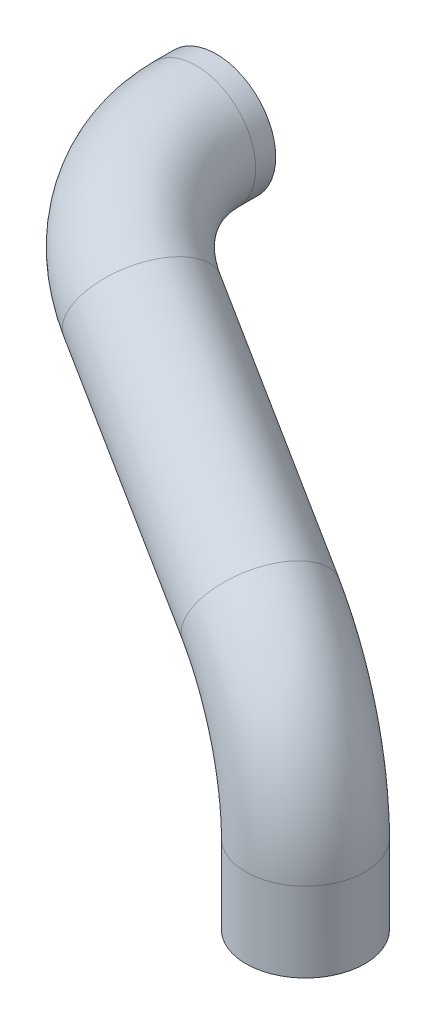
ISO-10303-21;
HEADER;
FILE_DESCRIPTION(('STEP AP214'),'2;1');
FILE_NAME('part.step','',(''),(''),'','','');
FILE_SCHEMA(('AUTOMOTIVE_DESIGN { 1 0 10303 214 1 1 1 1 }'));
ENDSEC;
DATA;
#1=APPLICATION_CONTEXT('core data for automotive mechanical design processes');
#2=APPLICATION_PROTOCOL_DEFINITION('international standard','automotive_design',2000,#1);
#3=PRODUCT_CONTEXT('',#1,'mechanical');
#4=PRODUCT('Part','Part','',(#3));
#5=PRODUCT_RELATED_PRODUCT_CATEGORY('part','',(#4));
#6=PRODUCT_DEFINITION_FORMATION('','',#4);
#7=PRODUCT_DEFINITION_CONTEXT('part definition',#1,'design');
#8=PRODUCT_DEFINITION('design','',#6,#7);
#9=PRODUCT_DEFINITION_SHAPE('','',#8);
#10=(LENGTH_UNIT() NAMED_UNIT(*) SI_UNIT(.MILLI.,.METRE.));
#11=(NAMED_UNIT(*) PLANE_ANGLE_UNIT() SI_UNIT($,.RADIAN.));
#12=(NAMED_UNIT(*) SI_UNIT($,.STERADIAN.) SOLID_ANGLE_UNIT());
#13=UNCERTAINTY_MEASURE_WITH_UNIT(LENGTH_MEASURE(1.E-05),#10,'distance_accuracy_value','');
#14=(GEOMETRIC_REPRESENTATION_CONTEXT(3) GLOBAL_UNCERTAINTY_ASSIGNED_CONTEXT((#13)) GLOBAL_UNIT_ASSIGNED_CONTEXT((#10,
#11,#12)) REPRESENTATION_CONTEXT('',''));
#15=CARTESIAN_POINT('',(0.,0.,0.));
#16=DIRECTION('',(0.,0.,1.));
#17=DIRECTION('',(1.,0.,0.));
#18=AXIS2_PLACEMENT_3D('',#15,#16,#17);
#19=CARTESIAN_POINT('',(-65.,60.,-50.));
#20=DIRECTION('',(0.,0.,1.));
#21=DIRECTION('',(1.,0.,0.));
#22=AXIS2_PLACEMENT_3D('',#19,#20,#21);
#23=PLANE('',#22);
#24=CARTESIAN_POINT('',(-65.,60.,-50.));
#25=DIRECTION('',(0.,0.,1.));
#26=DIRECTION('',(1.,0.,0.));
#27=AXIS2_PLACEMENT_3D('',#24,#25,#26);
#28=CIRCLE('',#27,7.5);
#29=CARTESIAN_POINT('',(-57.5,60.,-50.));
#30=VERTEX_POINT('',#29);
#31=EDGE_CURVE('E85',#30,#30,#28,.T.);
#32=ORIENTED_EDGE('',*,*,#31,.T.);
#33=EDGE_LOOP('',(#32));
#34=FACE_BOUND('',#33,.T.);
#35=CARTESIAN_POINT('',(-65.,60.,-50.));
#36=DIRECTION('',(0.,0.,1.));
#37=DIRECTION('',(1.,0.,0.));
#38=AXIS2_PLACEMENT_3D('',#35,#36,#37);
#39=CIRCLE('',#38,10.);
#40=CARTESIAN_POINT('',(-55.,60.,-50.));
#41=VERTEX_POINT('',#40);
#42=EDGE_CURVE('E76',#41,#41,#39,.T.);
#43=ORIENTED_EDGE('',*,*,#42,.F.);
#44=EDGE_LOOP('',(#43));
#45=FACE_BOUND('',#44,.T.);
#46=ADVANCED_FACE('F49',(#34,#45),#23,.F.);
#47=CARTESIAN_POINT('',(0.,0.,0.));
#48=DIRECTION('',(0.,-1.,0.));
#49=DIRECTION('',(0.635217758096736,0.,-0.772333088633756));
#50=AXIS2_PLACEMENT_3D('',#47,#48,#49);
#51=PLANE('',#50);
#52=CARTESIAN_POINT('',(0.,0.,0.));
#53=DIRECTION('',(0.,-1.,0.));
#54=DIRECTION('',(0.,0.,-1.));
#55=AXIS2_PLACEMENT_3D('',#52,#53,#54);
#56=CIRCLE('',#55,7.5);
#57=CARTESIAN_POINT('',(0.,0.,-7.50000000000002));
#58=VERTEX_POINT('',#57);
#59=EDGE_CURVE('E80',#58,#58,#56,.T.);
#60=ORIENTED_EDGE('',*,*,#59,.F.);
#61=EDGE_LOOP('',(#60));
#62=FACE_BOUND('',#61,.T.);
#63=CARTESIAN_POINT('',(0.,0.,0.));
#64=DIRECTION('',(0.,-1.,0.));
#65=DIRECTION('',(0.635217758096736,0.,-0.772333088633756));
#66=AXIS2_PLACEMENT_3D('',#63,#64,#65);
#67=CIRCLE('',#66,10.);
#68=CARTESIAN_POINT('',(6.35217758096736,0.,-7.72333088633757));
#69=VERTEX_POINT('',#68);
#70=EDGE_CURVE('E11',#69,#69,#67,.T.);
#71=ORIENTED_EDGE('',*,*,#70,.T.);
#72=EDGE_LOOP('',(#71));
#73=FACE_BOUND('',#72,.T.);
#74=ADVANCED_FACE('F133',(#62,#73),#51,.T.);
#75=CARTESIAN_POINT('',(-65.,60.,-50.));
#76=DIRECTION('',(0.,0.,1.));
#77=DIRECTION('',(1.,0.,0.));
#78=AXIS2_PLACEMENT_3D('',#75,#76,#77);
#79=CYLINDRICAL_SURFACE('',#78,10.);
#80=CARTESIAN_POINT('',(-65.,60.,-46.6299303751751));
#81=DIRECTION('',(0.,0.,1.));
#82=DIRECTION('',(1.,0.,0.));
#83=AXIS2_PLACEMENT_3D('',#80,#81,#82);
#84=CIRCLE('',#83,10.);
#85=CARTESIAN_POINT('',(-74.0795938450045,64.1905817746175,-46.6299303751751));
#86=VERTEX_POINT('',#85);
#87=EDGE_CURVE('E72',#86,#86,#84,.T.);
#88=ORIENTED_EDGE('',*,*,#87,.F.);
#89=EDGE_LOOP('',(#88));
#90=FACE_BOUND('',#89,.T.);
#91=ORIENTED_EDGE('',*,*,#42,.T.);
#92=EDGE_LOOP('',(#91));
#93=FACE_BOUND('',#92,.T.);
#94=ADVANCED_FACE('F135',(#90,#93),#79,.T.);
#95=CARTESIAN_POINT('',(-42.3010153874887,49.5235455634563,-46.6299303751751));
#96=DIRECTION('',(0.419058177461747,0.907959384500452,0.));
#97=DIRECTION('',(-0.907959384500452,0.419058177461747,0.));
#98=AXIS2_PLACEMENT_3D('',#95,#96,#97);
#99=TOROIDAL_SURFACE('',#98,25.,10.);
#100=CARTESIAN_POINT('',(-51.0740361979205,53.5726320913479,-23.5726320913479));
#101=DIRECTION('',(0.83740361432108,-0.386493975840498,0.386493975840499));
#102=DIRECTION('',(0.494231619107533,0.233431560411908,-0.83740361432108));
#103=AXIS2_PLACEMENT_3D('',#100,#101,#102);
#104=CIRCLE('',#103,10.);
#105=CARTESIAN_POINT('',(-54.5832445220932,55.1922667025046,-14.3497127778171));
#106=VERTEX_POINT('',#105);
#107=EDGE_CURVE('E66',#106,#106,#104,.T.);
#108=CARTESIAN_POINT('',(-42.3010153874887,49.5235455634563,-46.6299303751751));
#109=DIRECTION('',(0.419058177461747,0.907959384500452,0.));
#110=DIRECTION('',(-0.907959384500452,0.419058177461747,0.));
#111=AXIS2_PLACEMENT_3D('',#108,#109,#110);
#112=CIRCLE('',#111,35.);
#113=EDGE_CURVE('',#86,#106,#112,.T.);
#114=ORIENTED_EDGE('',*,*,#87,.T.);
#115=ORIENTED_EDGE('',*,*,#107,.F.);
#116=ORIENTED_EDGE('',*,*,#113,.T.);
#117=ORIENTED_EDGE('',*,*,#113,.F.);
#118=EDGE_LOOP('',(#114,#116,#115,#117));
#119=FACE_BOUND('',#118,.T.);
#120=ADVANCED_FACE('F141',(#119),#99,.T.);
#121=CARTESIAN_POINT('',(-51.0740361979205,53.5726320913479,-23.5726320913479));
#122=DIRECTION('',(0.83740361432108,-0.386493975840499,0.386493975840498));
#123=DIRECTION('',(0.419058177461747,0.907959384500452,0.));
#124=AXIS2_PLACEMENT_3D('',#121,#122,#123);
#125=CYLINDRICAL_SURFACE('',#124,10.);
#126=CARTESIAN_POINT('',(-13.9259638020795,36.4273679086521,-6.42736790865207));
#127=DIRECTION('',(0.83740361432108,-0.386493975840499,0.386493975840498));
#128=DIRECTION('',(0.494231619107533,0.233431560411908,-0.83740361432108));
#129=AXIS2_PLACEMENT_3D('',#126,#127,#128);
#130=CIRCLE('',#129,10.);
#131=CARTESIAN_POINT('',(-10.4167554779068,45.6502872221829,-4.80773329749543));
#132=VERTEX_POINT('',#131);
#133=EDGE_CURVE('E61',#132,#132,#130,.T.);
#134=ORIENTED_EDGE('',*,*,#133,.F.);
#135=EDGE_LOOP('',(#134));
#136=FACE_BOUND('',#135,.T.);
#137=ORIENTED_EDGE('',*,*,#107,.T.);
#138=EDGE_LOOP('',(#137));
#139=FACE_BOUND('',#138,.T.);
#140=ADVANCED_FACE('F129',(#136,#139),#125,.T.);
#141=CARTESIAN_POINT('',(-22.6989846125113,13.3700696248249,-10.4764544365437));
#142=DIRECTION('',(0.419058177461747,0.,-0.907959384500452));
#143=DIRECTION('',(-0.907959384500452,0.,-0.419058177461747));
#144=AXIS2_PLACEMENT_3D('',#141,#142,#143);
#145=TOROIDAL_SURFACE('',#144,25.,10.);
#146=CARTESIAN_POINT('',(0.,13.370069624825,0.));
#147=DIRECTION('',(0.,-1.,0.));
#148=DIRECTION('',(0.635217758096736,0.,-0.772333088633756));
#149=AXIS2_PLACEMENT_3D('',#146,#147,#148);
#150=CIRCLE('',#149,10.);
#151=CARTESIAN_POINT('',(9.07959384500452,13.370069624825,4.19058177461745));
#152=VERTEX_POINT('',#151);
#153=EDGE_CURVE('E56',#152,#152,#150,.T.);
#154=CARTESIAN_POINT('',(-22.6989846125113,13.3700696248249,-10.4764544365437));
#155=DIRECTION('',(0.419058177461747,0.,-0.907959384500452));
#156=DIRECTION('',(-0.907959384500452,0.,-0.419058177461747));
#157=AXIS2_PLACEMENT_3D('',#154,#155,#156);
#158=CIRCLE('',#157,35.);
#159=EDGE_CURVE('',#132,#152,#158,.T.);
#160=ORIENTED_EDGE('',*,*,#133,.T.);
#161=ORIENTED_EDGE('',*,*,#153,.F.);
#162=ORIENTED_EDGE('',*,*,#159,.T.);
#163=ORIENTED_EDGE('',*,*,#159,.F.);
#164=EDGE_LOOP('',(#160,#162,#161,#163));
#165=FACE_BOUND('',#164,.T.);
#166=ADVANCED_FACE('F123',(#165),#145,.T.);
#167=CARTESIAN_POINT('',(0.,13.370069624825,0.));
#168=DIRECTION('',(0.,-1.,0.));
#169=DIRECTION('',(0.,0.,-1.));
#170=AXIS2_PLACEMENT_3D('',#167,#168,#169);
#171=CYLINDRICAL_SURFACE('',#170,10.);
#172=ORIENTED_EDGE('',*,*,#70,.F.);
#173=EDGE_LOOP('',(#172));
#174=FACE_BOUND('',#173,.T.);
#175=ORIENTED_EDGE('',*,*,#153,.T.);
#176=EDGE_LOOP('',(#175));
#177=FACE_BOUND('',#176,.T.);
#178=ADVANCED_FACE('F120',(#174,#177),#171,.T.);
#179=CARTESIAN_POINT('',(-65.,60.,-50.));
#180=DIRECTION('',(0.,0.,1.));
#181=DIRECTION('',(1.,0.,0.));
#182=AXIS2_PLACEMENT_3D('',#179,#180,#181);
#183=CYLINDRICAL_SURFACE('',#182,7.5);
#184=CARTESIAN_POINT('',(-65.,60.,-46.6299303751751));
#185=DIRECTION('',(0.,0.,-1.));
#186=DIRECTION('',(-1.,0.,0.));
#187=AXIS2_PLACEMENT_3D('',#184,#185,#186);
#188=CIRCLE('',#187,7.5);
#189=CARTESIAN_POINT('',(-71.8096953837534,63.1429363309631,-46.6299303751751));
#190=VERTEX_POINT('',#189);
#191=EDGE_CURVE('E89',#190,#190,#188,.F.);
#192=ORIENTED_EDGE('',*,*,#191,.T.);
#193=EDGE_LOOP('',(#192));
#194=FACE_BOUND('',#193,.T.);
#195=ORIENTED_EDGE('',*,*,#31,.F.);
#196=EDGE_LOOP('',(#195));
#197=FACE_BOUND('',#196,.T.);
#198=ADVANCED_FACE('F105',(#194,#197),#183,.F.);
#199=CARTESIAN_POINT('',(-42.3010153874887,49.5235455634563,-46.6299303751751));
#200=DIRECTION('',(0.419058177461747,0.907959384500452,0.));
#201=DIRECTION('',(-0.907959384500452,0.419058177461747,0.));
#202=AXIS2_PLACEMENT_3D('',#199,#200,#201);
#203=TOROIDAL_SURFACE('',#202,25.,7.5);
#204=CARTESIAN_POINT('',(-51.0740361979205,53.5726320913479,-23.5726320913479));
#205=DIRECTION('',(0.83740361432108,-0.386493975840499,0.386493975840498));
#206=DIRECTION('',(0.419058177461747,0.907959384500452,0.));
#207=AXIS2_PLACEMENT_3D('',#204,#205,#206);
#208=CIRCLE('',#207,7.5);
#209=CARTESIAN_POINT('',(-53.70594244105,54.7873580497154,-16.6554426061998));
#210=VERTEX_POINT('',#209);
#211=EDGE_CURVE('E97',#210,#210,#208,.T.);
#212=CARTESIAN_POINT('',(-42.3010153874887,49.5235455634563,-46.6299303751751));
#213=DIRECTION('',(0.419058177461747,0.907959384500452,0.));
#214=DIRECTION('',(-0.907959384500452,0.419058177461747,0.));
#215=AXIS2_PLACEMENT_3D('',#212,#213,#214);
#216=CIRCLE('',#215,32.5);
#217=EDGE_CURVE('',#190,#210,#216,.T.);
#218=ORIENTED_EDGE('',*,*,#191,.F.);
#219=ORIENTED_EDGE('',*,*,#211,.T.);
#220=ORIENTED_EDGE('',*,*,#217,.T.);
#221=ORIENTED_EDGE('',*,*,#217,.F.);
#222=EDGE_LOOP('',(#218,#220,#219,#221));
#223=FACE_BOUND('',#222,.T.);
#224=ADVANCED_FACE('F108',(#223),#203,.F.);
#225=CARTESIAN_POINT('',(-51.0740361979205,53.5726320913479,-23.5726320913479));
#226=DIRECTION('',(0.83740361432108,-0.386493975840499,0.386493975840498));
#227=DIRECTION('',(0.419058177461747,0.907959384500452,0.));
#228=AXIS2_PLACEMENT_3D('',#225,#226,#227);
#229=CYLINDRICAL_SURFACE('',#228,7.5);
#230=CARTESIAN_POINT('',(-13.9259638020795,36.4273679086521,-6.42736790865208));
#231=DIRECTION('',(-0.83740361432108,0.386493975840499,-0.386493975840498));
#232=DIRECTION('',(-0.419058177461748,-0.907959384500451,0.));
#233=AXIS2_PLACEMENT_3D('',#230,#231,#232);
#234=CIRCLE('',#233,7.5);
#235=CARTESIAN_POINT('',(-11.2940575589499,43.3445573938002,-5.2126419502846));
#236=VERTEX_POINT('',#235);
#237=EDGE_CURVE('E93',#236,#236,#234,.F.);
#238=ORIENTED_EDGE('',*,*,#237,.T.);
#239=EDGE_LOOP('',(#238));
#240=FACE_BOUND('',#239,.T.);
#241=ORIENTED_EDGE('',*,*,#211,.F.);
#242=EDGE_LOOP('',(#241));
#243=FACE_BOUND('',#242,.T.);
#244=ADVANCED_FACE('F110',(#240,#243),#229,.F.);
#245=CARTESIAN_POINT('',(-22.6989846125113,13.3700696248249,-10.4764544365437));
#246=DIRECTION('',(0.419058177461747,0.,-0.907959384500452));
#247=DIRECTION('',(-0.907959384500452,0.,-0.419058177461747));
#248=AXIS2_PLACEMENT_3D('',#245,#246,#247);
#249=TOROIDAL_SURFACE('',#248,25.,7.5);
#250=CARTESIAN_POINT('',(0.,13.370069624825,0.));
#251=DIRECTION('',(0.,-1.,0.));
#252=DIRECTION('',(0.,0.,-1.));
#253=AXIS2_PLACEMENT_3D('',#250,#251,#252);
#254=CIRCLE('',#253,7.5);
#255=CARTESIAN_POINT('',(6.80969538375339,13.370069624825,3.14293633096309));
#256=VERTEX_POINT('',#255);
#257=EDGE_CURVE('E84',#256,#256,#254,.T.);
#258=CARTESIAN_POINT('',(-22.6989846125113,13.3700696248249,-10.4764544365437));
#259=DIRECTION('',(0.419058177461747,0.,-0.907959384500452));
#260=DIRECTION('',(-0.907959384500452,0.,-0.419058177461747));
#261=AXIS2_PLACEMENT_3D('',#258,#259,#260);
#262=CIRCLE('',#261,32.5);
#263=EDGE_CURVE('',#236,#256,#262,.T.);
#264=ORIENTED_EDGE('',*,*,#237,.F.);
#265=ORIENTED_EDGE('',*,*,#257,.T.);
#266=ORIENTED_EDGE('',*,*,#263,.T.);
#267=ORIENTED_EDGE('',*,*,#263,.F.);
#268=EDGE_LOOP('',(#264,#266,#265,#267));
#269=FACE_BOUND('',#268,.T.);
#270=ADVANCED_FACE('F117',(#269),#249,.F.);
#271=CARTESIAN_POINT('',(0.,13.370069624825,0.));
#272=DIRECTION('',(0.,-1.,0.));
#273=DIRECTION('',(0.,0.,-1.));
#274=AXIS2_PLACEMENT_3D('',#271,#272,#273);
#275=CYLINDRICAL_SURFACE('',#274,7.5);
#276=ORIENTED_EDGE('',*,*,#59,.T.);
#277=EDGE_LOOP('',(#276));
#278=FACE_BOUND('',#277,.T.);
#279=ORIENTED_EDGE('',*,*,#257,.F.);
#280=EDGE_LOOP('',(#279));
#281=FACE_BOUND('',#280,.T.);
#282=ADVANCED_FACE('F145',(#278,#281),#275,.F.);
#283=CLOSED_SHELL('',(#46,#74,#94,#120,#140,#166,#178,#198,#224,#244,#270,#282));
#284=MANIFOLD_SOLID_BREP('B2',#283);
#285=ADVANCED_BREP_SHAPE_REPRESENTATION('',(#18,#284),#14);
#286=SHAPE_DEFINITION_REPRESENTATION(#9,#285);
ENDSEC;
END-ISO-10303-21;
